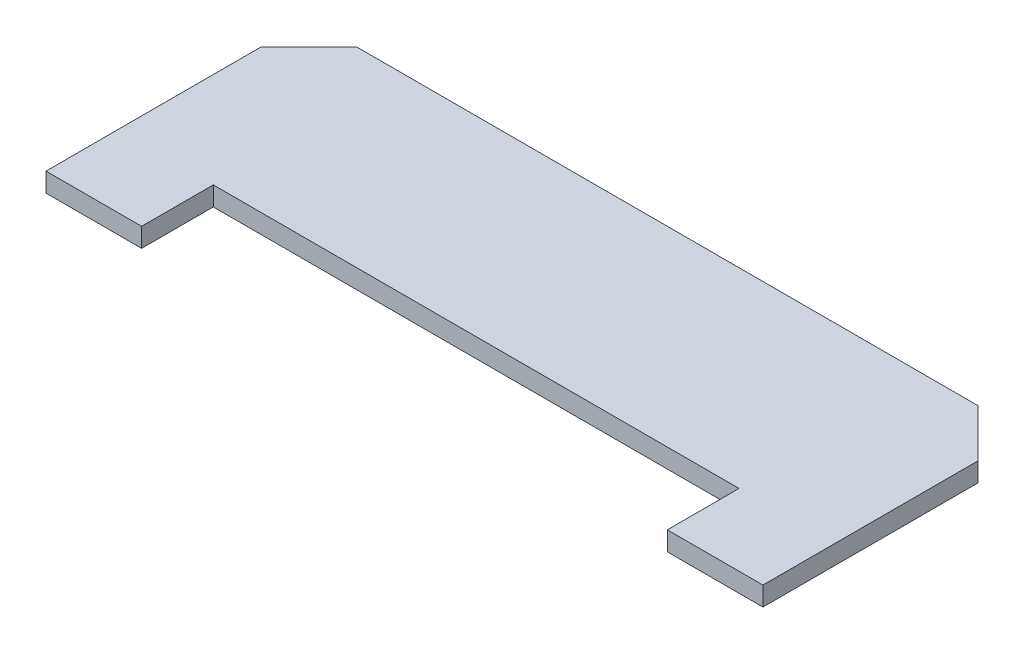
ISO-10303-21;
HEADER;
FILE_DESCRIPTION(('STEP AP214'),'2;1');
FILE_NAME('part.step','',(''),(''),'','','');
FILE_SCHEMA(('AUTOMOTIVE_DESIGN { 1 0 10303 214 1 1 1 1 }'));
ENDSEC;
DATA;
#1=APPLICATION_CONTEXT('core data for automotive mechanical design processes');
#2=APPLICATION_PROTOCOL_DEFINITION('international standard','automotive_design',2000,#1);
#3=PRODUCT_CONTEXT('',#1,'mechanical');
#4=PRODUCT('Part','Part','',(#3));
#5=PRODUCT_RELATED_PRODUCT_CATEGORY('part','',(#4));
#6=PRODUCT_DEFINITION_FORMATION('','',#4);
#7=PRODUCT_DEFINITION_CONTEXT('part definition',#1,'design');
#8=PRODUCT_DEFINITION('design','',#6,#7);
#9=PRODUCT_DEFINITION_SHAPE('','',#8);
#10=(LENGTH_UNIT() NAMED_UNIT(*) SI_UNIT(.MILLI.,.METRE.));
#11=(NAMED_UNIT(*) PLANE_ANGLE_UNIT() SI_UNIT($,.RADIAN.));
#12=(NAMED_UNIT(*) SI_UNIT($,.STERADIAN.) SOLID_ANGLE_UNIT());
#13=UNCERTAINTY_MEASURE_WITH_UNIT(LENGTH_MEASURE(1.E-05),#10,'distance_accuracy_value','');
#14=(GEOMETRIC_REPRESENTATION_CONTEXT(3) GLOBAL_UNCERTAINTY_ASSIGNED_CONTEXT((#13)) GLOBAL_UNIT_ASSIGNED_CONTEXT((#10,
#11,#12)) REPRESENTATION_CONTEXT('',''));
#15=CARTESIAN_POINT('',(0.,0.,0.));
#16=DIRECTION('',(0.,0.,1.));
#17=DIRECTION('',(1.,0.,0.));
#18=AXIS2_PLACEMENT_3D('',#15,#16,#17);
#19=CARTESIAN_POINT('',(3.41694879411521,4.,55.));
#20=DIRECTION('',(1.,0.,0.));
#21=DIRECTION('',(0.,0.,-1.));
#22=AXIS2_PLACEMENT_3D('',#19,#20,#21);
#23=PLANE('',#22);
#24=DIRECTION('',(0.,0.,1.));
#25=VECTOR('',#24,1.);
#26=CARTESIAN_POINT('',(3.41694879411521,0.,55.));
#27=LINE('',#26,#25);
#28=CARTESIAN_POINT('',(3.41694879411522,0.,10.));
#29=VERTEX_POINT('',#28);
#30=CARTESIAN_POINT('',(3.41694879411521,0.,55.));
#31=VERTEX_POINT('',#30);
#32=EDGE_CURVE('E147',#29,#31,#27,.T.);
#33=ORIENTED_EDGE('',*,*,#32,.T.);
#34=DIRECTION('',(0.,-1.,0.));
#35=VECTOR('',#34,1.);
#36=CARTESIAN_POINT('',(3.41694879411521,4.,55.));
#37=LINE('',#36,#35);
#38=CARTESIAN_POINT('',(3.41694879411521,4.,55.));
#39=VERTEX_POINT('',#38);
#40=EDGE_CURVE('E11',#39,#31,#37,.T.);
#41=ORIENTED_EDGE('',*,*,#40,.F.);
#42=DIRECTION('',(0.,0.,1.));
#43=VECTOR('',#42,1.);
#44=CARTESIAN_POINT('',(3.41694879411521,4.,55.));
#45=LINE('',#44,#43);
#46=CARTESIAN_POINT('',(3.41694879411522,4.,10.));
#47=VERTEX_POINT('',#46);
#48=EDGE_CURVE('E165',#47,#39,#45,.T.);
#49=ORIENTED_EDGE('',*,*,#48,.F.);
#50=DIRECTION('',(0.,-1.,0.));
#51=VECTOR('',#50,1.);
#52=CARTESIAN_POINT('',(3.41694879411522,4.,10.));
#53=LINE('',#52,#51);
#54=EDGE_CURVE('E143',#47,#29,#53,.T.);
#55=ORIENTED_EDGE('',*,*,#54,.T.);
#56=EDGE_LOOP('',(#33,#41,#49,#55));
#57=FACE_BOUND('',#56,.T.);
#58=ADVANCED_FACE('F39',(#57),#23,.F.);
#59=CARTESIAN_POINT('',(23.4169487941152,4.,55.));
#60=DIRECTION('',(0.,0.,-1.));
#61=DIRECTION('',(-1.,0.,0.));
#62=AXIS2_PLACEMENT_3D('',#59,#60,#61);
#63=PLANE('',#62);
#64=DIRECTION('',(1.,0.,0.));
#65=VECTOR('',#64,1.);
#66=CARTESIAN_POINT('',(23.4169487941152,0.,55.));
#67=LINE('',#66,#65);
#68=CARTESIAN_POINT('',(23.4169487941152,0.,55.));
#69=VERTEX_POINT('',#68);
#70=EDGE_CURVE('E150',#31,#69,#67,.T.);
#71=ORIENTED_EDGE('',*,*,#70,.T.);
#72=DIRECTION('',(0.,-1.,0.));
#73=VECTOR('',#72,1.);
#74=CARTESIAN_POINT('',(23.4169487941152,4.,55.));
#75=LINE('',#74,#73);
#76=CARTESIAN_POINT('',(23.4169487941152,4.,55.));
#77=VERTEX_POINT('',#76);
#78=EDGE_CURVE('E47',#77,#69,#75,.T.);
#79=ORIENTED_EDGE('',*,*,#78,.F.);
#80=DIRECTION('',(1.,0.,0.));
#81=VECTOR('',#80,1.);
#82=CARTESIAN_POINT('',(23.4169487941152,4.,55.));
#83=LINE('',#82,#81);
#84=EDGE_CURVE('E104',#39,#77,#83,.T.);
#85=ORIENTED_EDGE('',*,*,#84,.F.);
#86=ORIENTED_EDGE('',*,*,#40,.T.);
#87=EDGE_LOOP('',(#71,#79,#85,#86));
#88=FACE_BOUND('',#87,.T.);
#89=ADVANCED_FACE('F214',(#88),#63,.F.);
#90=CARTESIAN_POINT('',(23.4169487941152,4.,40.));
#91=DIRECTION('',(-1.,0.,0.));
#92=DIRECTION('',(0.,0.,1.));
#93=AXIS2_PLACEMENT_3D('',#90,#91,#92);
#94=PLANE('',#93);
#95=DIRECTION('',(0.,0.,-1.));
#96=VECTOR('',#95,1.);
#97=CARTESIAN_POINT('',(23.4169487941152,0.,40.));
#98=LINE('',#97,#96);
#99=CARTESIAN_POINT('',(23.4169487941152,0.,40.));
#100=VERTEX_POINT('',#99);
#101=EDGE_CURVE('E152',#69,#100,#98,.T.);
#102=ORIENTED_EDGE('',*,*,#101,.T.);
#103=DIRECTION('',(0.,-1.,0.));
#104=VECTOR('',#103,1.);
#105=CARTESIAN_POINT('',(23.4169487941152,4.,40.));
#106=LINE('',#105,#104);
#107=CARTESIAN_POINT('',(23.4169487941152,4.,40.));
#108=VERTEX_POINT('',#107);
#109=EDGE_CURVE('E178',#108,#100,#106,.T.);
#110=ORIENTED_EDGE('',*,*,#109,.F.);
#111=DIRECTION('',(0.,0.,-1.));
#112=VECTOR('',#111,1.);
#113=CARTESIAN_POINT('',(23.4169487941152,4.,40.));
#114=LINE('',#113,#112);
#115=EDGE_CURVE('E186',#77,#108,#114,.T.);
#116=ORIENTED_EDGE('',*,*,#115,.F.);
#117=ORIENTED_EDGE('',*,*,#78,.T.);
#118=EDGE_LOOP('',(#102,#110,#116,#117));
#119=FACE_BOUND('',#118,.T.);
#120=ADVANCED_FACE('F184',(#119),#94,.F.);
#121=CARTESIAN_POINT('',(133.416948794115,4.,40.));
#122=DIRECTION('',(0.,0.,-1.));
#123=DIRECTION('',(-1.,0.,0.));
#124=AXIS2_PLACEMENT_3D('',#121,#122,#123);
#125=PLANE('',#124);
#126=DIRECTION('',(1.,0.,0.));
#127=VECTOR('',#126,1.);
#128=CARTESIAN_POINT('',(133.416948794115,0.,40.));
#129=LINE('',#128,#127);
#130=CARTESIAN_POINT('',(133.416948794115,0.,40.));
#131=VERTEX_POINT('',#130);
#132=EDGE_CURVE('E154',#100,#131,#129,.T.);
#133=ORIENTED_EDGE('',*,*,#132,.T.);
#134=DIRECTION('',(0.,-1.,0.));
#135=VECTOR('',#134,1.);
#136=CARTESIAN_POINT('',(133.416948794115,4.,40.));
#137=LINE('',#136,#135);
#138=CARTESIAN_POINT('',(133.416948794115,4.,40.));
#139=VERTEX_POINT('',#138);
#140=EDGE_CURVE('E175',#139,#131,#137,.T.);
#141=ORIENTED_EDGE('',*,*,#140,.F.);
#142=DIRECTION('',(1.,0.,0.));
#143=VECTOR('',#142,1.);
#144=CARTESIAN_POINT('',(133.416948794115,4.,40.));
#145=LINE('',#144,#143);
#146=EDGE_CURVE('E204',#108,#139,#145,.T.);
#147=ORIENTED_EDGE('',*,*,#146,.F.);
#148=ORIENTED_EDGE('',*,*,#109,.T.);
#149=EDGE_LOOP('',(#133,#141,#147,#148));
#150=FACE_BOUND('',#149,.T.);
#151=ADVANCED_FACE('F195',(#150),#125,.F.);
#152=CARTESIAN_POINT('',(133.416948794115,4.,55.));
#153=DIRECTION('',(1.,0.,0.));
#154=DIRECTION('',(0.,0.,-1.));
#155=AXIS2_PLACEMENT_3D('',#152,#153,#154);
#156=PLANE('',#155);
#157=DIRECTION('',(0.,0.,1.));
#158=VECTOR('',#157,1.);
#159=CARTESIAN_POINT('',(133.416948794115,0.,55.));
#160=LINE('',#159,#158);
#161=CARTESIAN_POINT('',(133.416948794115,0.,55.));
#162=VERTEX_POINT('',#161);
#163=EDGE_CURVE('E156',#131,#162,#160,.T.);
#164=ORIENTED_EDGE('',*,*,#163,.T.);
#165=DIRECTION('',(0.,-1.,0.));
#166=VECTOR('',#165,1.);
#167=CARTESIAN_POINT('',(133.416948794115,4.,55.));
#168=LINE('',#167,#166);
#169=CARTESIAN_POINT('',(133.416948794115,4.,55.));
#170=VERTEX_POINT('',#169);
#171=EDGE_CURVE('E172',#170,#162,#168,.T.);
#172=ORIENTED_EDGE('',*,*,#171,.F.);
#173=DIRECTION('',(0.,0.,1.));
#174=VECTOR('',#173,1.);
#175=CARTESIAN_POINT('',(133.416948794115,4.,55.));
#176=LINE('',#175,#174);
#177=EDGE_CURVE('E201',#139,#170,#176,.T.);
#178=ORIENTED_EDGE('',*,*,#177,.F.);
#179=ORIENTED_EDGE('',*,*,#140,.T.);
#180=EDGE_LOOP('',(#164,#172,#178,#179));
#181=FACE_BOUND('',#180,.T.);
#182=ADVANCED_FACE('F199',(#181),#156,.F.);
#183=CARTESIAN_POINT('',(153.416948794115,4.,55.));
#184=DIRECTION('',(0.,0.,-1.));
#185=DIRECTION('',(-1.,0.,0.));
#186=AXIS2_PLACEMENT_3D('',#183,#184,#185);
#187=PLANE('',#186);
#188=DIRECTION('',(1.,0.,0.));
#189=VECTOR('',#188,1.);
#190=CARTESIAN_POINT('',(153.416948794115,0.,55.));
#191=LINE('',#190,#189);
#192=CARTESIAN_POINT('',(153.416948794115,0.,55.));
#193=VERTEX_POINT('',#192);
#194=EDGE_CURVE('E158',#162,#193,#191,.T.);
#195=ORIENTED_EDGE('',*,*,#194,.T.);
#196=DIRECTION('',(0.,-1.,0.));
#197=VECTOR('',#196,1.);
#198=CARTESIAN_POINT('',(153.416948794115,4.,55.));
#199=LINE('',#198,#197);
#200=CARTESIAN_POINT('',(153.416948794115,4.,55.));
#201=VERTEX_POINT('',#200);
#202=EDGE_CURVE('E169',#201,#193,#199,.T.);
#203=ORIENTED_EDGE('',*,*,#202,.F.);
#204=DIRECTION('',(1.,0.,0.));
#205=VECTOR('',#204,1.);
#206=CARTESIAN_POINT('',(153.416948794115,4.,55.));
#207=LINE('',#206,#205);
#208=EDGE_CURVE('E203',#170,#201,#207,.T.);
#209=ORIENTED_EDGE('',*,*,#208,.F.);
#210=ORIENTED_EDGE('',*,*,#171,.T.);
#211=EDGE_LOOP('',(#195,#203,#209,#210));
#212=FACE_BOUND('',#211,.T.);
#213=ADVANCED_FACE('F226',(#212),#187,.F.);
#214=CARTESIAN_POINT('',(153.416948794115,4.,10.));
#215=DIRECTION('',(-1.,0.,0.));
#216=DIRECTION('',(0.,0.,1.));
#217=AXIS2_PLACEMENT_3D('',#214,#215,#216);
#218=PLANE('',#217);
#219=DIRECTION('',(0.,0.,-1.));
#220=VECTOR('',#219,1.);
#221=CARTESIAN_POINT('',(153.416948794115,0.,10.));
#222=LINE('',#221,#220);
#223=CARTESIAN_POINT('',(153.416948794115,0.,10.));
#224=VERTEX_POINT('',#223);
#225=EDGE_CURVE('E160',#193,#224,#222,.T.);
#226=ORIENTED_EDGE('',*,*,#225,.T.);
#227=DIRECTION('',(0.,-1.,0.));
#228=VECTOR('',#227,1.);
#229=CARTESIAN_POINT('',(153.416948794115,4.,10.));
#230=LINE('',#229,#228);
#231=CARTESIAN_POINT('',(153.416948794115,4.,10.));
#232=VERTEX_POINT('',#231);
#233=EDGE_CURVE('E138',#232,#224,#230,.T.);
#234=ORIENTED_EDGE('',*,*,#233,.F.);
#235=DIRECTION('',(0.,0.,-1.));
#236=VECTOR('',#235,1.);
#237=CARTESIAN_POINT('',(153.416948794115,4.,10.));
#238=LINE('',#237,#236);
#239=EDGE_CURVE('E129',#201,#232,#238,.T.);
#240=ORIENTED_EDGE('',*,*,#239,.F.);
#241=ORIENTED_EDGE('',*,*,#202,.T.);
#242=EDGE_LOOP('',(#226,#234,#240,#241));
#243=FACE_BOUND('',#242,.T.);
#244=ADVANCED_FACE('F229',(#243),#218,.F.);
#245=CARTESIAN_POINT('',(143.416948794115,4.,0.));
#246=DIRECTION('',(-0.707106781186547,0.,0.707106781186548));
#247=DIRECTION('',(0.707106781186548,0.,0.707106781186547));
#248=AXIS2_PLACEMENT_3D('',#245,#246,#247);
#249=PLANE('',#248);
#250=DIRECTION('',(-0.707106781186548,0.,-0.707106781186547));
#251=VECTOR('',#250,1.);
#252=CARTESIAN_POINT('',(143.416948794115,0.,0.));
#253=LINE('',#252,#251);
#254=CARTESIAN_POINT('',(143.416948794115,0.,0.));
#255=VERTEX_POINT('',#254);
#256=EDGE_CURVE('E137',#224,#255,#253,.T.);
#257=ORIENTED_EDGE('',*,*,#256,.T.);
#258=DIRECTION('',(0.,-1.,0.));
#259=VECTOR('',#258,1.);
#260=CARTESIAN_POINT('',(143.416948794115,4.,0.));
#261=LINE('',#260,#259);
#262=CARTESIAN_POINT('',(143.416948794115,4.,0.));
#263=VERTEX_POINT('',#262);
#264=EDGE_CURVE('E134',#263,#255,#261,.T.);
#265=ORIENTED_EDGE('',*,*,#264,.F.);
#266=DIRECTION('',(-0.707106781186548,0.,-0.707106781186547));
#267=VECTOR('',#266,1.);
#268=CARTESIAN_POINT('',(143.416948794115,4.,0.));
#269=LINE('',#268,#267);
#270=EDGE_CURVE('E123',#232,#263,#269,.T.);
#271=ORIENTED_EDGE('',*,*,#270,.F.);
#272=ORIENTED_EDGE('',*,*,#233,.T.);
#273=EDGE_LOOP('',(#257,#265,#271,#272));
#274=FACE_BOUND('',#273,.T.);
#275=ADVANCED_FACE('F135',(#274),#249,.F.);
#276=CARTESIAN_POINT('',(13.4169487941152,4.,0.));
#277=DIRECTION('',(0.,0.,1.));
#278=DIRECTION('',(1.,0.,0.));
#279=AXIS2_PLACEMENT_3D('',#276,#277,#278);
#280=PLANE('',#279);
#281=DIRECTION('',(-1.,0.,0.));
#282=VECTOR('',#281,1.);
#283=CARTESIAN_POINT('',(13.4169487941152,0.,0.));
#284=LINE('',#283,#282);
#285=CARTESIAN_POINT('',(13.4169487941152,0.,0.));
#286=VERTEX_POINT('',#285);
#287=EDGE_CURVE('E90',#255,#286,#284,.T.);
#288=ORIENTED_EDGE('',*,*,#287,.T.);
#289=DIRECTION('',(0.,-1.,0.));
#290=VECTOR('',#289,1.);
#291=CARTESIAN_POINT('',(13.4169487941152,4.,0.));
#292=LINE('',#291,#290);
#293=CARTESIAN_POINT('',(13.4169487941152,4.,0.));
#294=VERTEX_POINT('',#293);
#295=EDGE_CURVE('E139',#294,#286,#292,.T.);
#296=ORIENTED_EDGE('',*,*,#295,.F.);
#297=DIRECTION('',(-1.,0.,0.));
#298=VECTOR('',#297,1.);
#299=CARTESIAN_POINT('',(13.4169487941152,4.,0.));
#300=LINE('',#299,#298);
#301=EDGE_CURVE('E127',#263,#294,#300,.T.);
#302=ORIENTED_EDGE('',*,*,#301,.F.);
#303=ORIENTED_EDGE('',*,*,#264,.T.);
#304=EDGE_LOOP('',(#288,#296,#302,#303));
#305=FACE_BOUND('',#304,.T.);
#306=ADVANCED_FACE('F141',(#305),#280,.F.);
#307=CARTESIAN_POINT('',(3.41694879411522,4.,10.));
#308=DIRECTION('',(0.707106781186547,0.,0.707106781186547));
#309=DIRECTION('',(0.707106781186548,0.,-0.707106781186548));
#310=AXIS2_PLACEMENT_3D('',#307,#308,#309);
#311=PLANE('',#310);
#312=DIRECTION('',(-0.707106781186548,0.,0.707106781186548));
#313=VECTOR('',#312,1.);
#314=CARTESIAN_POINT('',(3.41694879411522,0.,10.));
#315=LINE('',#314,#313);
#316=EDGE_CURVE('E96',#286,#29,#315,.T.);
#317=ORIENTED_EDGE('',*,*,#316,.T.);
#318=ORIENTED_EDGE('',*,*,#54,.F.);
#319=DIRECTION('',(-0.707106781186548,0.,0.707106781186548));
#320=VECTOR('',#319,1.);
#321=CARTESIAN_POINT('',(3.41694879411522,4.,10.));
#322=LINE('',#321,#320);
#323=EDGE_CURVE('E55',#294,#47,#322,.T.);
#324=ORIENTED_EDGE('',*,*,#323,.F.);
#325=ORIENTED_EDGE('',*,*,#295,.T.);
#326=EDGE_LOOP('',(#317,#318,#324,#325));
#327=FACE_BOUND('',#326,.T.);
#328=ADVANCED_FACE('F238',(#327),#311,.F.);
#329=CARTESIAN_POINT('',(0.,4.,0.));
#330=DIRECTION('',(0.,-1.,0.));
#331=DIRECTION('',(0.,0.,-1.));
#332=AXIS2_PLACEMENT_3D('',#329,#330,#331);
#333=PLANE('',#332);
#334=ORIENTED_EDGE('',*,*,#48,.T.);
#335=ORIENTED_EDGE('',*,*,#84,.T.);
#336=ORIENTED_EDGE('',*,*,#115,.T.);
#337=ORIENTED_EDGE('',*,*,#146,.T.);
#338=ORIENTED_EDGE('',*,*,#177,.T.);
#339=ORIENTED_EDGE('',*,*,#208,.T.);
#340=ORIENTED_EDGE('',*,*,#239,.T.);
#341=ORIENTED_EDGE('',*,*,#270,.T.);
#342=ORIENTED_EDGE('',*,*,#301,.T.);
#343=ORIENTED_EDGE('',*,*,#323,.T.);
#344=EDGE_LOOP('',(#334,#335,#336,#337,#338,#339,#340,#341,#342,#343));
#345=FACE_BOUND('',#344,.T.);
#346=ADVANCED_FACE('F125',(#345),#333,.F.);
#347=CARTESIAN_POINT('',(0.,0.,0.));
#348=DIRECTION('',(0.,-1.,0.));
#349=DIRECTION('',(0.,0.,-1.));
#350=AXIS2_PLACEMENT_3D('',#347,#348,#349);
#351=PLANE('',#350);
#352=ORIENTED_EDGE('',*,*,#32,.F.);
#353=ORIENTED_EDGE('',*,*,#316,.F.);
#354=ORIENTED_EDGE('',*,*,#287,.F.);
#355=ORIENTED_EDGE('',*,*,#256,.F.);
#356=ORIENTED_EDGE('',*,*,#225,.F.);
#357=ORIENTED_EDGE('',*,*,#194,.F.);
#358=ORIENTED_EDGE('',*,*,#163,.F.);
#359=ORIENTED_EDGE('',*,*,#132,.F.);
#360=ORIENTED_EDGE('',*,*,#101,.F.);
#361=ORIENTED_EDGE('',*,*,#70,.F.);
#362=EDGE_LOOP('',(#352,#353,#354,#355,#356,#357,#358,#359,#360,#361));
#363=FACE_BOUND('',#362,.T.);
#364=ADVANCED_FACE('F190',(#363),#351,.T.);
#365=CLOSED_SHELL('',(#58,#89,#120,#151,#182,#213,#244,#275,#306,#328,#346,#364));
#366=MANIFOLD_SOLID_BREP('B2',#365);
#367=ADVANCED_BREP_SHAPE_REPRESENTATION('',(#18,#366),#14);
#368=SHAPE_DEFINITION_REPRESENTATION(#9,#367);
ENDSEC;
END-ISO-10303-21;
